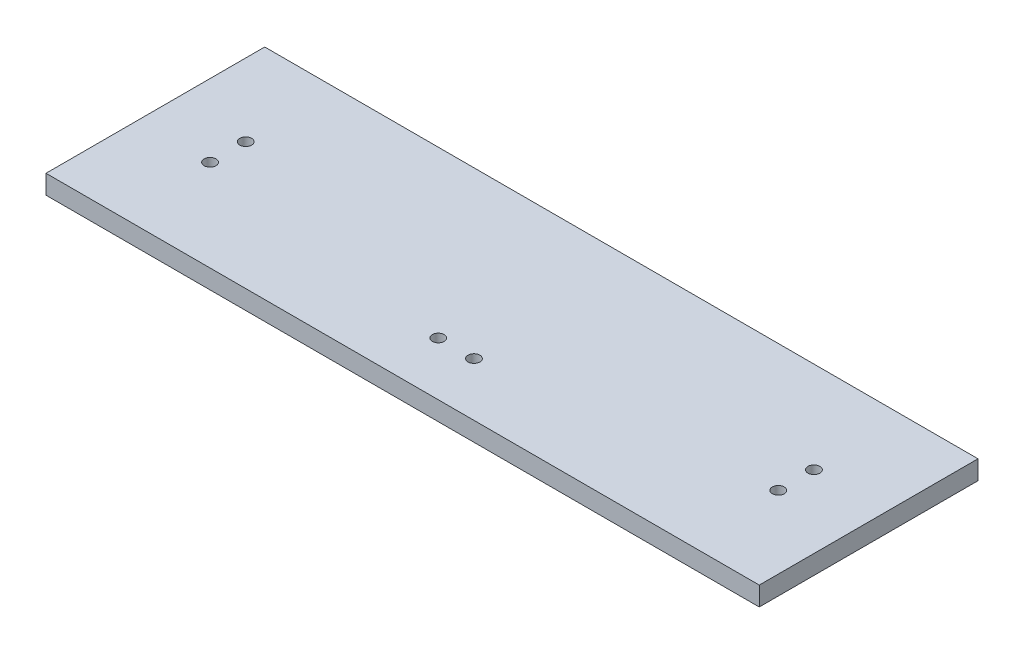
ISO-10303-21;
HEADER;
FILE_DESCRIPTION(('STEP AP214'),'2;1');
FILE_NAME('part.step','',(''),(''),'','','');
FILE_SCHEMA(('AUTOMOTIVE_DESIGN { 1 0 10303 214 1 1 1 1 }'));
ENDSEC;
DATA;
#1=APPLICATION_CONTEXT('core data for automotive mechanical design processes');
#2=APPLICATION_PROTOCOL_DEFINITION('international standard','automotive_design',2000,#1);
#3=PRODUCT_CONTEXT('',#1,'mechanical');
#4=PRODUCT('Part','Part','',(#3));
#5=PRODUCT_RELATED_PRODUCT_CATEGORY('part','',(#4));
#6=PRODUCT_DEFINITION_FORMATION('','',#4);
#7=PRODUCT_DEFINITION_CONTEXT('part definition',#1,'design');
#8=PRODUCT_DEFINITION('design','',#6,#7);
#9=PRODUCT_DEFINITION_SHAPE('','',#8);
#10=(LENGTH_UNIT() NAMED_UNIT(*) SI_UNIT(.MILLI.,.METRE.));
#11=(NAMED_UNIT(*) PLANE_ANGLE_UNIT() SI_UNIT($,.RADIAN.));
#12=(NAMED_UNIT(*) SI_UNIT($,.STERADIAN.) SOLID_ANGLE_UNIT());
#13=UNCERTAINTY_MEASURE_WITH_UNIT(LENGTH_MEASURE(1.E-05),#10,'distance_accuracy_value','');
#14=(GEOMETRIC_REPRESENTATION_CONTEXT(3) GLOBAL_UNCERTAINTY_ASSIGNED_CONTEXT((#13)) GLOBAL_UNIT_ASSIGNED_CONTEXT((#10,
#11,#12)) REPRESENTATION_CONTEXT('',''));
#15=CARTESIAN_POINT('',(0.,0.,0.));
#16=DIRECTION('',(0.,0.,1.));
#17=DIRECTION('',(1.,0.,0.));
#18=AXIS2_PLACEMENT_3D('',#15,#16,#17);
#19=CARTESIAN_POINT('',(-150.,8.,46.));
#20=DIRECTION('',(1.,0.,0.));
#21=DIRECTION('',(0.,0.,-1.));
#22=AXIS2_PLACEMENT_3D('',#19,#20,#21);
#23=PLANE('',#22);
#24=DIRECTION('',(0.,0.,1.));
#25=VECTOR('',#24,1.);
#26=CARTESIAN_POINT('',(-150.,0.,46.));
#27=LINE('',#26,#25);
#28=CARTESIAN_POINT('',(-150.,0.,-46.));
#29=VERTEX_POINT('',#28);
#30=CARTESIAN_POINT('',(-150.,0.,46.));
#31=VERTEX_POINT('',#30);
#32=EDGE_CURVE('E99',#29,#31,#27,.T.);
#33=ORIENTED_EDGE('',*,*,#32,.T.);
#34=DIRECTION('',(0.,-1.,0.));
#35=VECTOR('',#34,1.);
#36=CARTESIAN_POINT('',(-150.,8.,46.));
#37=LINE('',#36,#35);
#38=CARTESIAN_POINT('',(-150.,8.,46.));
#39=VERTEX_POINT('',#38);
#40=EDGE_CURVE('E11',#39,#31,#37,.T.);
#41=ORIENTED_EDGE('',*,*,#40,.F.);
#42=DIRECTION('',(0.,0.,1.));
#43=VECTOR('',#42,1.);
#44=CARTESIAN_POINT('',(-150.,8.,46.));
#45=LINE('',#44,#43);
#46=CARTESIAN_POINT('',(-150.,8.,-46.));
#47=VERTEX_POINT('',#46);
#48=EDGE_CURVE('E87',#47,#39,#45,.T.);
#49=ORIENTED_EDGE('',*,*,#48,.F.);
#50=DIRECTION('',(0.,-1.,0.));
#51=VECTOR('',#50,1.);
#52=CARTESIAN_POINT('',(-150.,8.,-46.));
#53=LINE('',#52,#51);
#54=EDGE_CURVE('E95',#47,#29,#53,.T.);
#55=ORIENTED_EDGE('',*,*,#54,.T.);
#56=EDGE_LOOP('',(#33,#41,#49,#55));
#57=FACE_BOUND('',#56,.T.);
#58=ADVANCED_FACE('F36',(#57),#23,.F.);
#59=CARTESIAN_POINT('',(150.,8.,46.));
#60=DIRECTION('',(0.,0.,-1.));
#61=DIRECTION('',(-1.,0.,0.));
#62=AXIS2_PLACEMENT_3D('',#59,#60,#61);
#63=PLANE('',#62);
#64=DIRECTION('',(1.,0.,0.));
#65=VECTOR('',#64,1.);
#66=CARTESIAN_POINT('',(150.,0.,46.));
#67=LINE('',#66,#65);
#68=CARTESIAN_POINT('',(150.,0.,46.));
#69=VERTEX_POINT('',#68);
#70=EDGE_CURVE('E91',#31,#69,#67,.T.);
#71=ORIENTED_EDGE('',*,*,#70,.T.);
#72=DIRECTION('',(0.,-1.,0.));
#73=VECTOR('',#72,1.);
#74=CARTESIAN_POINT('',(150.,8.,46.));
#75=LINE('',#74,#73);
#76=CARTESIAN_POINT('',(150.,8.,46.));
#77=VERTEX_POINT('',#76);
#78=EDGE_CURVE('E44',#77,#69,#75,.T.);
#79=ORIENTED_EDGE('',*,*,#78,.F.);
#80=DIRECTION('',(1.,0.,0.));
#81=VECTOR('',#80,1.);
#82=CARTESIAN_POINT('',(150.,8.,46.));
#83=LINE('',#82,#81);
#84=EDGE_CURVE('E82',#39,#77,#83,.T.);
#85=ORIENTED_EDGE('',*,*,#84,.F.);
#86=ORIENTED_EDGE('',*,*,#40,.T.);
#87=EDGE_LOOP('',(#71,#79,#85,#86));
#88=FACE_BOUND('',#87,.T.);
#89=ADVANCED_FACE('F90',(#88),#63,.F.);
#90=CARTESIAN_POINT('',(150.,8.,46.));
#91=DIRECTION('',(-1.,0.,0.));
#92=DIRECTION('',(0.,0.,1.));
#93=AXIS2_PLACEMENT_3D('',#90,#91,#92);
#94=PLANE('',#93);
#95=DIRECTION('',(0.,0.,-1.));
#96=VECTOR('',#95,1.);
#97=CARTESIAN_POINT('',(150.,0.,46.));
#98=LINE('',#97,#96);
#99=CARTESIAN_POINT('',(150.,0.,-46.));
#100=VERTEX_POINT('',#99);
#101=EDGE_CURVE('E69',#69,#100,#98,.T.);
#102=ORIENTED_EDGE('',*,*,#101,.T.);
#103=DIRECTION('',(0.,-1.,0.));
#104=VECTOR('',#103,1.);
#105=CARTESIAN_POINT('',(150.,8.,-46.));
#106=LINE('',#105,#104);
#107=CARTESIAN_POINT('',(150.,8.,-46.));
#108=VERTEX_POINT('',#107);
#109=EDGE_CURVE('E92',#108,#100,#106,.T.);
#110=ORIENTED_EDGE('',*,*,#109,.F.);
#111=DIRECTION('',(0.,0.,-1.));
#112=VECTOR('',#111,1.);
#113=CARTESIAN_POINT('',(150.,8.,46.));
#114=LINE('',#113,#112);
#115=EDGE_CURVE('E85',#77,#108,#114,.T.);
#116=ORIENTED_EDGE('',*,*,#115,.F.);
#117=ORIENTED_EDGE('',*,*,#78,.T.);
#118=EDGE_LOOP('',(#102,#110,#116,#117));
#119=FACE_BOUND('',#118,.T.);
#120=ADVANCED_FACE('F93',(#119),#94,.F.);
#121=CARTESIAN_POINT('',(150.,8.,-46.));
#122=DIRECTION('',(0.,0.,1.));
#123=DIRECTION('',(1.,0.,0.));
#124=AXIS2_PLACEMENT_3D('',#121,#122,#123);
#125=PLANE('',#124);
#126=DIRECTION('',(-1.,0.,0.));
#127=VECTOR('',#126,1.);
#128=CARTESIAN_POINT('',(150.,0.,-46.));
#129=LINE('',#128,#127);
#130=EDGE_CURVE('E75',#100,#29,#129,.T.);
#131=ORIENTED_EDGE('',*,*,#130,.T.);
#132=ORIENTED_EDGE('',*,*,#54,.F.);
#133=DIRECTION('',(-1.,0.,0.));
#134=VECTOR('',#133,1.);
#135=CARTESIAN_POINT('',(150.,8.,-46.));
#136=LINE('',#135,#134);
#137=EDGE_CURVE('E52',#108,#47,#136,.T.);
#138=ORIENTED_EDGE('',*,*,#137,.F.);
#139=ORIENTED_EDGE('',*,*,#109,.T.);
#140=EDGE_LOOP('',(#131,#132,#138,#139));
#141=FACE_BOUND('',#140,.T.);
#142=ADVANCED_FACE('F107',(#141),#125,.F.);
#143=CARTESIAN_POINT('',(0.,8.,0.));
#144=DIRECTION('',(0.,1.,0.));
#145=DIRECTION('',(0.,0.,1.));
#146=AXIS2_PLACEMENT_3D('',#143,#144,#145);
#147=PLANE('',#146);
#148=CARTESIAN_POINT('',(-119.5,8.,-7.50000000000003));
#149=DIRECTION('',(0.,1.,0.));
#150=DIRECTION('',(0.,0.,1.));
#151=AXIS2_PLACEMENT_3D('',#148,#149,#150);
#152=CIRCLE('',#151,2.5);
#153=CARTESIAN_POINT('',(-119.5,8.,-5.00000000000003));
#154=VERTEX_POINT('',#153);
#155=EDGE_CURVE('E142',#154,#154,#152,.T.);
#156=ORIENTED_EDGE('',*,*,#155,.F.);
#157=EDGE_LOOP('',(#156));
#158=FACE_BOUND('',#157,.T.);
#159=CARTESIAN_POINT('',(-119.5,8.,7.49999999999997));
#160=DIRECTION('',(0.,1.,0.));
#161=DIRECTION('',(0.,0.,1.));
#162=AXIS2_PLACEMENT_3D('',#159,#160,#161);
#163=CIRCLE('',#162,2.5);
#164=CARTESIAN_POINT('',(-119.5,8.,9.99999999999997));
#165=VERTEX_POINT('',#164);
#166=EDGE_CURVE('E136',#165,#165,#163,.T.);
#167=ORIENTED_EDGE('',*,*,#166,.F.);
#168=EDGE_LOOP('',(#167));
#169=FACE_BOUND('',#168,.T.);
#170=CARTESIAN_POINT('',(-7.49999999999988,8.,23.5));
#171=DIRECTION('',(0.,1.,0.));
#172=DIRECTION('',(0.,0.,1.));
#173=AXIS2_PLACEMENT_3D('',#170,#171,#172);
#174=CIRCLE('',#173,2.5);
#175=CARTESIAN_POINT('',(-7.49999999999988,8.,26.));
#176=VERTEX_POINT('',#175);
#177=EDGE_CURVE('E130',#176,#176,#174,.T.);
#178=ORIENTED_EDGE('',*,*,#177,.F.);
#179=EDGE_LOOP('',(#178));
#180=FACE_BOUND('',#179,.T.);
#181=CARTESIAN_POINT('',(7.50000000000012,8.,23.5));
#182=DIRECTION('',(0.,1.,0.));
#183=DIRECTION('',(0.,0.,1.));
#184=AXIS2_PLACEMENT_3D('',#181,#182,#183);
#185=CIRCLE('',#184,2.5);
#186=CARTESIAN_POINT('',(7.50000000000012,8.,26.));
#187=VERTEX_POINT('',#186);
#188=EDGE_CURVE('E124',#187,#187,#185,.T.);
#189=ORIENTED_EDGE('',*,*,#188,.F.);
#190=EDGE_LOOP('',(#189));
#191=FACE_BOUND('',#190,.T.);
#192=CARTESIAN_POINT('',(119.5,8.,7.49999999999997));
#193=DIRECTION('',(0.,1.,0.));
#194=DIRECTION('',(0.,0.,1.));
#195=AXIS2_PLACEMENT_3D('',#192,#193,#194);
#196=CIRCLE('',#195,2.5);
#197=CARTESIAN_POINT('',(119.5,8.,9.99999999999997));
#198=VERTEX_POINT('',#197);
#199=EDGE_CURVE('E118',#198,#198,#196,.T.);
#200=ORIENTED_EDGE('',*,*,#199,.F.);
#201=EDGE_LOOP('',(#200));
#202=FACE_BOUND('',#201,.T.);
#203=CARTESIAN_POINT('',(119.5,8.,-7.50000000000003));
#204=DIRECTION('',(0.,1.,0.));
#205=DIRECTION('',(0.,0.,1.));
#206=AXIS2_PLACEMENT_3D('',#203,#204,#205);
#207=CIRCLE('',#206,2.5);
#208=CARTESIAN_POINT('',(119.5,8.,-5.00000000000003));
#209=VERTEX_POINT('',#208);
#210=EDGE_CURVE('E102',#209,#209,#207,.T.);
#211=ORIENTED_EDGE('',*,*,#210,.F.);
#212=EDGE_LOOP('',(#211));
#213=FACE_BOUND('',#212,.T.);
#214=ORIENTED_EDGE('',*,*,#48,.T.);
#215=ORIENTED_EDGE('',*,*,#84,.T.);
#216=ORIENTED_EDGE('',*,*,#115,.T.);
#217=ORIENTED_EDGE('',*,*,#137,.T.);
#218=EDGE_LOOP('',(#214,#215,#216,#217));
#219=FACE_BOUND('',#218,.T.);
#220=ADVANCED_FACE('F83',(#158,#169,#180,#191,#202,#213,#219),#147,.T.);
#221=CARTESIAN_POINT('',(0.,0.,0.));
#222=DIRECTION('',(0.,1.,0.));
#223=DIRECTION('',(0.,0.,1.));
#224=AXIS2_PLACEMENT_3D('',#221,#222,#223);
#225=PLANE('',#224);
#226=CARTESIAN_POINT('',(-119.5,0.,-7.50000000000003));
#227=DIRECTION('',(0.,-1.,0.));
#228=DIRECTION('',(0.,0.,-1.));
#229=AXIS2_PLACEMENT_3D('',#226,#227,#228);
#230=CIRCLE('',#229,2.5);
#231=CARTESIAN_POINT('',(-119.5,0.,-10.));
#232=VERTEX_POINT('',#231);
#233=EDGE_CURVE('E145',#232,#232,#230,.T.);
#234=ORIENTED_EDGE('',*,*,#233,.F.);
#235=EDGE_LOOP('',(#234));
#236=FACE_BOUND('',#235,.T.);
#237=CARTESIAN_POINT('',(-119.5,0.,7.49999999999997));
#238=DIRECTION('',(0.,-1.,0.));
#239=DIRECTION('',(0.,0.,-1.));
#240=AXIS2_PLACEMENT_3D('',#237,#238,#239);
#241=CIRCLE('',#240,2.5);
#242=CARTESIAN_POINT('',(-119.5,0.,4.99999999999998));
#243=VERTEX_POINT('',#242);
#244=EDGE_CURVE('E139',#243,#243,#241,.T.);
#245=ORIENTED_EDGE('',*,*,#244,.F.);
#246=EDGE_LOOP('',(#245));
#247=FACE_BOUND('',#246,.T.);
#248=CARTESIAN_POINT('',(-7.49999999999988,0.,23.5));
#249=DIRECTION('',(0.,-1.,0.));
#250=DIRECTION('',(0.,0.,-1.));
#251=AXIS2_PLACEMENT_3D('',#248,#249,#250);
#252=CIRCLE('',#251,2.5);
#253=CARTESIAN_POINT('',(-7.49999999999988,0.,21.));
#254=VERTEX_POINT('',#253);
#255=EDGE_CURVE('E133',#254,#254,#252,.T.);
#256=ORIENTED_EDGE('',*,*,#255,.F.);
#257=EDGE_LOOP('',(#256));
#258=FACE_BOUND('',#257,.T.);
#259=CARTESIAN_POINT('',(7.50000000000012,0.,23.5));
#260=DIRECTION('',(0.,-1.,0.));
#261=DIRECTION('',(0.,0.,-1.));
#262=AXIS2_PLACEMENT_3D('',#259,#260,#261);
#263=CIRCLE('',#262,2.5);
#264=CARTESIAN_POINT('',(7.50000000000012,0.,21.));
#265=VERTEX_POINT('',#264);
#266=EDGE_CURVE('E127',#265,#265,#263,.T.);
#267=ORIENTED_EDGE('',*,*,#266,.F.);
#268=EDGE_LOOP('',(#267));
#269=FACE_BOUND('',#268,.T.);
#270=CARTESIAN_POINT('',(119.5,0.,7.49999999999997));
#271=DIRECTION('',(0.,-1.,0.));
#272=DIRECTION('',(0.,0.,-1.));
#273=AXIS2_PLACEMENT_3D('',#270,#271,#272);
#274=CIRCLE('',#273,2.5);
#275=CARTESIAN_POINT('',(119.5,0.,4.99999999999998));
#276=VERTEX_POINT('',#275);
#277=EDGE_CURVE('E121',#276,#276,#274,.T.);
#278=ORIENTED_EDGE('',*,*,#277,.F.);
#279=EDGE_LOOP('',(#278));
#280=FACE_BOUND('',#279,.T.);
#281=CARTESIAN_POINT('',(119.5,0.,-7.50000000000003));
#282=DIRECTION('',(0.,-1.,0.));
#283=DIRECTION('',(0.,0.,-1.));
#284=AXIS2_PLACEMENT_3D('',#281,#282,#283);
#285=CIRCLE('',#284,2.5);
#286=CARTESIAN_POINT('',(119.5,0.,-10.));
#287=VERTEX_POINT('',#286);
#288=EDGE_CURVE('E115',#287,#287,#285,.T.);
#289=ORIENTED_EDGE('',*,*,#288,.F.);
#290=EDGE_LOOP('',(#289));
#291=FACE_BOUND('',#290,.T.);
#292=ORIENTED_EDGE('',*,*,#32,.F.);
#293=ORIENTED_EDGE('',*,*,#130,.F.);
#294=ORIENTED_EDGE('',*,*,#101,.F.);
#295=ORIENTED_EDGE('',*,*,#70,.F.);
#296=EDGE_LOOP('',(#292,#293,#294,#295));
#297=FACE_BOUND('',#296,.T.);
#298=ADVANCED_FACE('F110',(#236,#247,#258,#269,#280,#291,#297),#225,.F.);
#299=CARTESIAN_POINT('',(119.5,10.,-7.50000000000003));
#300=DIRECTION('',(0.,-1.,0.));
#301=DIRECTION('',(0.,0.,-1.));
#302=AXIS2_PLACEMENT_3D('',#299,#300,#301);
#303=CYLINDRICAL_SURFACE('',#302,2.5);
#304=ORIENTED_EDGE('',*,*,#210,.T.);
#305=EDGE_LOOP('',(#304));
#306=FACE_BOUND('',#305,.T.);
#307=ORIENTED_EDGE('',*,*,#288,.T.);
#308=EDGE_LOOP('',(#307));
#309=FACE_BOUND('',#308,.T.);
#310=ADVANCED_FACE('F153',(#306,#309),#303,.F.);
#311=CARTESIAN_POINT('',(119.5,10.,7.49999999999997));
#312=DIRECTION('',(0.,-1.,0.));
#313=DIRECTION('',(0.,0.,-1.));
#314=AXIS2_PLACEMENT_3D('',#311,#312,#313);
#315=CYLINDRICAL_SURFACE('',#314,2.5);
#316=ORIENTED_EDGE('',*,*,#199,.T.);
#317=EDGE_LOOP('',(#316));
#318=FACE_BOUND('',#317,.T.);
#319=ORIENTED_EDGE('',*,*,#277,.T.);
#320=EDGE_LOOP('',(#319));
#321=FACE_BOUND('',#320,.T.);
#322=ADVANCED_FACE('F166',(#318,#321),#315,.F.);
#323=CARTESIAN_POINT('',(7.50000000000012,10.,23.5));
#324=DIRECTION('',(0.,-1.,0.));
#325=DIRECTION('',(0.,0.,-1.));
#326=AXIS2_PLACEMENT_3D('',#323,#324,#325);
#327=CYLINDRICAL_SURFACE('',#326,2.5);
#328=ORIENTED_EDGE('',*,*,#188,.T.);
#329=EDGE_LOOP('',(#328));
#330=FACE_BOUND('',#329,.T.);
#331=ORIENTED_EDGE('',*,*,#266,.T.);
#332=EDGE_LOOP('',(#331));
#333=FACE_BOUND('',#332,.T.);
#334=ADVANCED_FACE('F173',(#330,#333),#327,.F.);
#335=CARTESIAN_POINT('',(-7.49999999999988,10.,23.5));
#336=DIRECTION('',(0.,-1.,0.));
#337=DIRECTION('',(0.,0.,-1.));
#338=AXIS2_PLACEMENT_3D('',#335,#336,#337);
#339=CYLINDRICAL_SURFACE('',#338,2.5);
#340=ORIENTED_EDGE('',*,*,#177,.T.);
#341=EDGE_LOOP('',(#340));
#342=FACE_BOUND('',#341,.T.);
#343=ORIENTED_EDGE('',*,*,#255,.T.);
#344=EDGE_LOOP('',(#343));
#345=FACE_BOUND('',#344,.T.);
#346=ADVANCED_FACE('F207',(#342,#345),#339,.F.);
#347=CARTESIAN_POINT('',(-119.5,10.,7.49999999999997));
#348=DIRECTION('',(0.,-1.,0.));
#349=DIRECTION('',(0.,0.,-1.));
#350=AXIS2_PLACEMENT_3D('',#347,#348,#349);
#351=CYLINDRICAL_SURFACE('',#350,2.5);
#352=ORIENTED_EDGE('',*,*,#166,.T.);
#353=EDGE_LOOP('',(#352));
#354=FACE_BOUND('',#353,.T.);
#355=ORIENTED_EDGE('',*,*,#244,.T.);
#356=EDGE_LOOP('',(#355));
#357=FACE_BOUND('',#356,.T.);
#358=ADVANCED_FACE('F212',(#354,#357),#351,.F.);
#359=CARTESIAN_POINT('',(-119.5,10.,-7.50000000000003));
#360=DIRECTION('',(0.,-1.,0.));
#361=DIRECTION('',(0.,0.,-1.));
#362=AXIS2_PLACEMENT_3D('',#359,#360,#361);
#363=CYLINDRICAL_SURFACE('',#362,2.5);
#364=ORIENTED_EDGE('',*,*,#155,.T.);
#365=EDGE_LOOP('',(#364));
#366=FACE_BOUND('',#365,.T.);
#367=ORIENTED_EDGE('',*,*,#233,.T.);
#368=EDGE_LOOP('',(#367));
#369=FACE_BOUND('',#368,.T.);
#370=ADVANCED_FACE('F149',(#366,#369),#363,.F.);
#371=CLOSED_SHELL('',(#58,#89,#120,#142,#220,#298,#310,#322,#334,#346,#358,#370));
#372=MANIFOLD_SOLID_BREP('B2',#371);
#373=ADVANCED_BREP_SHAPE_REPRESENTATION('',(#18,#372),#14);
#374=SHAPE_DEFINITION_REPRESENTATION(#9,#373);
ENDSEC;
END-ISO-10303-21;
